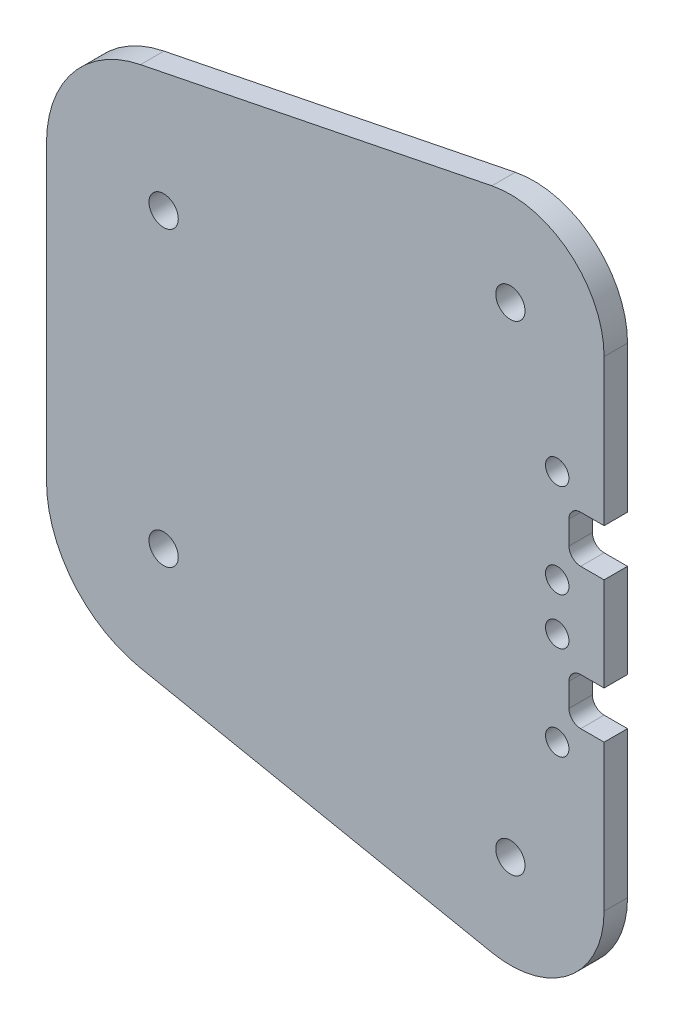
ISO-10303-21;
HEADER;
FILE_DESCRIPTION(('STEP AP214'),'2;1');
FILE_NAME('part.step','',(''),(''),'','','');
FILE_SCHEMA(('AUTOMOTIVE_DESIGN { 1 0 10303 214 1 1 1 1 }'));
ENDSEC;
DATA;
#1=APPLICATION_CONTEXT('core data for automotive mechanical design processes');
#2=APPLICATION_PROTOCOL_DEFINITION('international standard','automotive_design',2000,#1);
#3=PRODUCT_CONTEXT('',#1,'mechanical');
#4=PRODUCT('Part','Part','',(#3));
#5=PRODUCT_RELATED_PRODUCT_CATEGORY('part','',(#4));
#6=PRODUCT_DEFINITION_FORMATION('','',#4);
#7=PRODUCT_DEFINITION_CONTEXT('part definition',#1,'design');
#8=PRODUCT_DEFINITION('design','',#6,#7);
#9=PRODUCT_DEFINITION_SHAPE('','',#8);
#10=(LENGTH_UNIT() NAMED_UNIT(*) SI_UNIT(.MILLI.,.METRE.));
#11=(NAMED_UNIT(*) PLANE_ANGLE_UNIT() SI_UNIT($,.RADIAN.));
#12=(NAMED_UNIT(*) SI_UNIT($,.STERADIAN.) SOLID_ANGLE_UNIT());
#13=UNCERTAINTY_MEASURE_WITH_UNIT(LENGTH_MEASURE(1.E-05),#10,'distance_accuracy_value','');
#14=(GEOMETRIC_REPRESENTATION_CONTEXT(3) GLOBAL_UNCERTAINTY_ASSIGNED_CONTEXT((#13)) GLOBAL_UNIT_ASSIGNED_CONTEXT((#10,
#11,#12)) REPRESENTATION_CONTEXT('',''));
#15=CARTESIAN_POINT('',(0.,0.,0.));
#16=DIRECTION('',(0.,0.,1.));
#17=DIRECTION('',(1.,0.,0.));
#18=AXIS2_PLACEMENT_3D('',#15,#16,#17);
#19=CARTESIAN_POINT('',(-18.5419050672055,-9.11799410029498,2.));
#20=DIRECTION('',(0.,0.,-1.));
#21=DIRECTION('',(-1.,0.,0.));
#22=AXIS2_PLACEMENT_3D('',#19,#20,#21);
#23=PLANE('',#22);
#24=CARTESIAN_POINT('',(-18.5419050672055,-9.11799410029498,2.));
#25=DIRECTION('',(0.,0.,1.));
#26=DIRECTION('',(-1.,0.,0.));
#27=AXIS2_PLACEMENT_3D('',#24,#25,#26);
#28=CIRCLE('',#27,10.);
#29=CARTESIAN_POINT('',(-20.5157590368805,0.685265587502647,2.));
#30=VERTEX_POINT('',#29);
#31=CARTESIAN_POINT('',(-28.5419050672055,-9.11799410029498,2.));
#32=VERTEX_POINT('',#31);
#33=EDGE_CURVE('E240',#30,#32,#28,.T.);
#34=ORIENTED_EDGE('',*,*,#33,.T.);
#35=DIRECTION('',(0.,-1.,0.));
#36=VECTOR('',#35,1.);
#37=CARTESIAN_POINT('',(-28.5419050672055,-9.11799410029498,2.));
#38=LINE('',#37,#36);
#39=CARTESIAN_POINT('',(-28.5419050672054,-34.117994100295,2.));
#40=VERTEX_POINT('',#39);
#41=EDGE_CURVE('E128',#32,#40,#38,.T.);
#42=ORIENTED_EDGE('',*,*,#41,.T.);
#43=CARTESIAN_POINT('',(-18.5419050672054,-34.117994100295,2.));
#44=DIRECTION('',(0.,0.,1.));
#45=DIRECTION('',(1.,0.,0.));
#46=AXIS2_PLACEMENT_3D('',#43,#44,#45);
#47=CIRCLE('',#46,9.99999999999999);
#48=CARTESIAN_POINT('',(-20.5157590368804,-43.9212537880926,2.));
#49=VERTEX_POINT('',#48);
#50=EDGE_CURVE('E291',#40,#49,#47,.T.);
#51=ORIENTED_EDGE('',*,*,#50,.T.);
#52=DIRECTION('',(0.980325968779763,-0.197385396967504,0.));
#53=VECTOR('',#52,1.);
#54=CARTESIAN_POINT('',(-20.5157590368804,-43.9212537880926,2.));
#55=LINE('',#54,#53);
#56=CARTESIAN_POINT('',(9.47901175705458,-49.9606018505331,2.));
#57=VERTEX_POINT('',#56);
#58=EDGE_CURVE('E310',#49,#57,#55,.T.);
#59=ORIENTED_EDGE('',*,*,#58,.T.);
#60=CARTESIAN_POINT('',(11.0580949327946,-42.117994100295,2.));
#61=DIRECTION('',(0.,0.,1.));
#62=DIRECTION('',(-1.,0.,0.));
#63=AXIS2_PLACEMENT_3D('',#60,#61,#62);
#64=CIRCLE('',#63,8.);
#65=CARTESIAN_POINT('',(19.0580949327946,-42.117994100295,2.));
#66=VERTEX_POINT('',#65);
#67=EDGE_CURVE('E307',#57,#66,#64,.T.);
#68=ORIENTED_EDGE('',*,*,#67,.T.);
#69=DIRECTION('',(0.,1.,0.));
#70=VECTOR('',#69,1.);
#71=CARTESIAN_POINT('',(19.0580949327946,-29.617994100295,2.));
#72=LINE('',#71,#70);
#73=CARTESIAN_POINT('',(19.0580949327946,-29.617994100295,2.));
#74=VERTEX_POINT('',#73);
#75=EDGE_CURVE('E309',#66,#74,#72,.T.);
#76=ORIENTED_EDGE('',*,*,#75,.T.);
#77=DIRECTION('',(-1.,0.,0.));
#78=VECTOR('',#77,1.);
#79=CARTESIAN_POINT('',(19.0580949327946,-29.617994100295,2.));
#80=LINE('',#79,#78);
#81=CARTESIAN_POINT('',(17.0580949327946,-29.617994100295,2.));
#82=VERTEX_POINT('',#81);
#83=EDGE_CURVE('E312',#74,#82,#80,.T.);
#84=ORIENTED_EDGE('',*,*,#83,.T.);
#85=CARTESIAN_POINT('',(17.0580949327946,-28.617994100295,2.));
#86=DIRECTION('',(0.,0.,-1.));
#87=DIRECTION('',(1.,0.,0.));
#88=AXIS2_PLACEMENT_3D('',#85,#86,#87);
#89=CIRCLE('',#88,1.);
#90=CARTESIAN_POINT('',(16.0580949327946,-28.617994100295,2.));
#91=VERTEX_POINT('',#90);
#92=EDGE_CURVE('E318',#82,#91,#89,.T.);
#93=ORIENTED_EDGE('',*,*,#92,.T.);
#94=DIRECTION('',(0.,1.,0.));
#95=VECTOR('',#94,1.);
#96=CARTESIAN_POINT('',(16.0580949327946,-26.617994100295,2.));
#97=LINE('',#96,#95);
#98=CARTESIAN_POINT('',(16.0580949327946,-26.617994100295,2.));
#99=VERTEX_POINT('',#98);
#100=EDGE_CURVE('E320',#91,#99,#97,.T.);
#101=ORIENTED_EDGE('',*,*,#100,.T.);
#102=CARTESIAN_POINT('',(17.0580949327946,-26.617994100295,2.));
#103=DIRECTION('',(0.,0.,-1.));
#104=DIRECTION('',(1.,0.,0.));
#105=AXIS2_PLACEMENT_3D('',#102,#103,#104);
#106=CIRCLE('',#105,1.);
#107=CARTESIAN_POINT('',(17.0580949327946,-25.617994100295,2.));
#108=VERTEX_POINT('',#107);
#109=EDGE_CURVE('E322',#99,#108,#106,.T.);
#110=ORIENTED_EDGE('',*,*,#109,.T.);
#111=DIRECTION('',(1.,0.,0.));
#112=VECTOR('',#111,1.);
#113=CARTESIAN_POINT('',(19.0580949327946,-25.617994100295,2.));
#114=LINE('',#113,#112);
#115=CARTESIAN_POINT('',(19.0580949327946,-25.617994100295,2.));
#116=VERTEX_POINT('',#115);
#117=EDGE_CURVE('E324',#108,#116,#114,.T.);
#118=ORIENTED_EDGE('',*,*,#117,.T.);
#119=DIRECTION('',(0.,1.,0.));
#120=VECTOR('',#119,1.);
#121=CARTESIAN_POINT('',(19.0580949327945,-17.617994100295,2.));
#122=LINE('',#121,#120);
#123=CARTESIAN_POINT('',(19.0580949327945,-17.617994100295,2.));
#124=VERTEX_POINT('',#123);
#125=EDGE_CURVE('E326',#116,#124,#122,.T.);
#126=ORIENTED_EDGE('',*,*,#125,.T.);
#127=DIRECTION('',(-1.,0.,0.));
#128=VECTOR('',#127,1.);
#129=CARTESIAN_POINT('',(19.0580949327945,-17.617994100295,2.));
#130=LINE('',#129,#128);
#131=CARTESIAN_POINT('',(17.0580949327945,-17.617994100295,2.));
#132=VERTEX_POINT('',#131);
#133=EDGE_CURVE('E328',#124,#132,#130,.T.);
#134=ORIENTED_EDGE('',*,*,#133,.T.);
#135=CARTESIAN_POINT('',(17.0580949327945,-16.617994100295,2.));
#136=DIRECTION('',(0.,0.,-1.));
#137=DIRECTION('',(1.,0.,0.));
#138=AXIS2_PLACEMENT_3D('',#135,#136,#137);
#139=CIRCLE('',#138,1.);
#140=CARTESIAN_POINT('',(16.0580949327945,-16.617994100295,2.));
#141=VERTEX_POINT('',#140);
#142=EDGE_CURVE('E330',#132,#141,#139,.T.);
#143=ORIENTED_EDGE('',*,*,#142,.T.);
#144=DIRECTION('',(0.,1.,0.));
#145=VECTOR('',#144,1.);
#146=CARTESIAN_POINT('',(16.0580949327945,-14.617994100295,2.));
#147=LINE('',#146,#145);
#148=CARTESIAN_POINT('',(16.0580949327945,-14.617994100295,2.));
#149=VERTEX_POINT('',#148);
#150=EDGE_CURVE('E332',#141,#149,#147,.T.);
#151=ORIENTED_EDGE('',*,*,#150,.T.);
#152=CARTESIAN_POINT('',(17.0580949327945,-14.617994100295,2.));
#153=DIRECTION('',(0.,0.,-1.));
#154=DIRECTION('',(1.,0.,0.));
#155=AXIS2_PLACEMENT_3D('',#152,#153,#154);
#156=CIRCLE('',#155,1.);
#157=CARTESIAN_POINT('',(17.0580949327945,-13.617994100295,2.));
#158=VERTEX_POINT('',#157);
#159=EDGE_CURVE('E334',#149,#158,#156,.T.);
#160=ORIENTED_EDGE('',*,*,#159,.T.);
#161=DIRECTION('',(1.,0.,0.));
#162=VECTOR('',#161,1.);
#163=CARTESIAN_POINT('',(19.0580949327945,-13.617994100295,2.));
#164=LINE('',#163,#162);
#165=CARTESIAN_POINT('',(19.0580949327945,-13.617994100295,2.));
#166=VERTEX_POINT('',#165);
#167=EDGE_CURVE('E183',#158,#166,#164,.T.);
#168=ORIENTED_EDGE('',*,*,#167,.T.);
#169=DIRECTION('',(0.,1.,0.));
#170=VECTOR('',#169,1.);
#171=CARTESIAN_POINT('',(19.0580949327945,-13.617994100295,2.));
#172=LINE('',#171,#170);
#173=CARTESIAN_POINT('',(19.0580949327945,-1.11799410029498,2.));
#174=VERTEX_POINT('',#173);
#175=EDGE_CURVE('E177',#166,#174,#172,.T.);
#176=ORIENTED_EDGE('',*,*,#175,.T.);
#177=CARTESIAN_POINT('',(11.0580949327945,-1.11799410029498,2.));
#178=DIRECTION('',(0.,0.,1.));
#179=DIRECTION('',(1.,0.,0.));
#180=AXIS2_PLACEMENT_3D('',#177,#178,#179);
#181=CIRCLE('',#180,8.);
#182=CARTESIAN_POINT('',(9.4790117570545,6.72461364994313,2.));
#183=VERTEX_POINT('',#182);
#184=EDGE_CURVE('E181',#174,#183,#181,.T.);
#185=ORIENTED_EDGE('',*,*,#184,.T.);
#186=DIRECTION('',(-0.980325968779763,-0.197385396967504,0.));
#187=VECTOR('',#186,1.);
#188=CARTESIAN_POINT('',(-20.5157590368805,0.685265587502647,2.));
#189=LINE('',#188,#187);
#190=EDGE_CURVE('E49',#183,#30,#189,.T.);
#191=ORIENTED_EDGE('',*,*,#190,.T.);
#192=EDGE_LOOP('',(#34,#42,#51,#59,#68,#76,#84,#93,#101,#110,#118,#126,#134,#143,#151,#160,#168,
#176,#185,#191));
#193=FACE_BOUND('',#192,.T.);
#194=CARTESIAN_POINT('',(-18.5419050672054,-34.117994100295,2.));
#195=DIRECTION('',(0.,0.,1.));
#196=DIRECTION('',(1.,0.,0.));
#197=AXIS2_PLACEMENT_3D('',#194,#195,#196);
#198=CIRCLE('',#197,1.25);
#199=CARTESIAN_POINT('',(-17.2919050672054,-34.117994100295,2.));
#200=VERTEX_POINT('',#199);
#201=EDGE_CURVE('E205',#200,#200,#198,.T.);
#202=ORIENTED_EDGE('',*,*,#201,.F.);
#203=EDGE_LOOP('',(#202));
#204=FACE_BOUND('',#203,.T.);
#205=CARTESIAN_POINT('',(-18.5419050672055,-9.11799410029498,2.));
#206=DIRECTION('',(0.,0.,1.));
#207=DIRECTION('',(1.,0.,0.));
#208=AXIS2_PLACEMENT_3D('',#205,#206,#207);
#209=CIRCLE('',#208,1.25);
#210=CARTESIAN_POINT('',(-17.2919050672055,-9.11799410029498,2.));
#211=VERTEX_POINT('',#210);
#212=EDGE_CURVE('E438',#211,#211,#209,.T.);
#213=ORIENTED_EDGE('',*,*,#212,.F.);
#214=EDGE_LOOP('',(#213));
#215=FACE_BOUND('',#214,.T.);
#216=CARTESIAN_POINT('',(15.0580949327945,-11.617994100295,2.));
#217=DIRECTION('',(0.,0.,1.));
#218=DIRECTION('',(1.,0.,0.));
#219=AXIS2_PLACEMENT_3D('',#216,#217,#218);
#220=CIRCLE('',#219,1.);
#221=CARTESIAN_POINT('',(16.0580949327945,-11.617994100295,2.));
#222=VERTEX_POINT('',#221);
#223=EDGE_CURVE('E432',#222,#222,#220,.T.);
#224=ORIENTED_EDGE('',*,*,#223,.F.);
#225=EDGE_LOOP('',(#224));
#226=FACE_BOUND('',#225,.T.);
#227=CARTESIAN_POINT('',(11.0580949327945,-1.11799410029498,2.));
#228=DIRECTION('',(0.,0.,1.));
#229=DIRECTION('',(1.,0.,0.));
#230=AXIS2_PLACEMENT_3D('',#227,#228,#229);
#231=CIRCLE('',#230,1.25);
#232=CARTESIAN_POINT('',(12.3080949327945,-1.11799410029498,2.));
#233=VERTEX_POINT('',#232);
#234=EDGE_CURVE('E426',#233,#233,#231,.T.);
#235=ORIENTED_EDGE('',*,*,#234,.F.);
#236=EDGE_LOOP('',(#235));
#237=FACE_BOUND('',#236,.T.);
#238=CARTESIAN_POINT('',(15.0580949327945,-19.617994100295,2.));
#239=DIRECTION('',(0.,0.,1.));
#240=DIRECTION('',(1.,0.,0.));
#241=AXIS2_PLACEMENT_3D('',#238,#239,#240);
#242=CIRCLE('',#241,1.);
#243=CARTESIAN_POINT('',(16.0580949327945,-19.617994100295,2.));
#244=VERTEX_POINT('',#243);
#245=EDGE_CURVE('E420',#244,#244,#242,.T.);
#246=ORIENTED_EDGE('',*,*,#245,.F.);
#247=EDGE_LOOP('',(#246));
#248=FACE_BOUND('',#247,.T.);
#249=CARTESIAN_POINT('',(15.0580949327945,-23.617994100295,2.));
#250=DIRECTION('',(0.,0.,1.));
#251=DIRECTION('',(1.,0.,0.));
#252=AXIS2_PLACEMENT_3D('',#249,#250,#251);
#253=CIRCLE('',#252,1.);
#254=CARTESIAN_POINT('',(16.0580949327945,-23.617994100295,2.));
#255=VERTEX_POINT('',#254);
#256=EDGE_CURVE('E414',#255,#255,#253,.T.);
#257=ORIENTED_EDGE('',*,*,#256,.F.);
#258=EDGE_LOOP('',(#257));
#259=FACE_BOUND('',#258,.T.);
#260=CARTESIAN_POINT('',(15.0580949327945,-31.617994100295,2.));
#261=DIRECTION('',(0.,0.,1.));
#262=DIRECTION('',(1.,0.,0.));
#263=AXIS2_PLACEMENT_3D('',#260,#261,#262);
#264=CIRCLE('',#263,1.);
#265=CARTESIAN_POINT('',(16.0580949327945,-31.617994100295,2.));
#266=VERTEX_POINT('',#265);
#267=EDGE_CURVE('E408',#266,#266,#264,.T.);
#268=ORIENTED_EDGE('',*,*,#267,.F.);
#269=EDGE_LOOP('',(#268));
#270=FACE_BOUND('',#269,.T.);
#271=CARTESIAN_POINT('',(11.0580949327946,-42.117994100295,2.));
#272=DIRECTION('',(0.,0.,1.));
#273=DIRECTION('',(1.,0.,0.));
#274=AXIS2_PLACEMENT_3D('',#271,#272,#273);
#275=CIRCLE('',#274,1.25);
#276=CARTESIAN_POINT('',(12.3080949327946,-42.117994100295,2.));
#277=VERTEX_POINT('',#276);
#278=EDGE_CURVE('E399',#277,#277,#275,.T.);
#279=ORIENTED_EDGE('',*,*,#278,.F.);
#280=EDGE_LOOP('',(#279));
#281=FACE_BOUND('',#280,.T.);
#282=ADVANCED_FACE('F32',(#193,#204,#215,#226,#237,#248,#259,#270,#281),#23,.F.);
#283=CARTESIAN_POINT('',(-18.5419050672055,-9.11799410029498,0.));
#284=DIRECTION('',(0.,0.,-1.));
#285=DIRECTION('',(-1.,0.,0.));
#286=AXIS2_PLACEMENT_3D('',#283,#284,#285);
#287=PLANE('',#286);
#288=CARTESIAN_POINT('',(15.0580949327945,-31.617994100295,0.));
#289=DIRECTION('',(0.,0.,1.));
#290=DIRECTION('',(1.,0.,0.));
#291=AXIS2_PLACEMENT_3D('',#288,#289,#290);
#292=CIRCLE('',#291,1.);
#293=CARTESIAN_POINT('',(16.0580949327945,-31.617994100295,0.));
#294=VERTEX_POINT('',#293);
#295=EDGE_CURVE('E405',#294,#294,#292,.T.);
#296=ORIENTED_EDGE('',*,*,#295,.T.);
#297=EDGE_LOOP('',(#296));
#298=FACE_BOUND('',#297,.T.);
#299=CARTESIAN_POINT('',(15.0580949327945,-19.617994100295,0.));
#300=DIRECTION('',(0.,0.,1.));
#301=DIRECTION('',(1.,0.,0.));
#302=AXIS2_PLACEMENT_3D('',#299,#300,#301);
#303=CIRCLE('',#302,1.);
#304=CARTESIAN_POINT('',(16.0580949327945,-19.617994100295,0.));
#305=VERTEX_POINT('',#304);
#306=EDGE_CURVE('E417',#305,#305,#303,.T.);
#307=ORIENTED_EDGE('',*,*,#306,.T.);
#308=EDGE_LOOP('',(#307));
#309=FACE_BOUND('',#308,.T.);
#310=CARTESIAN_POINT('',(15.0580949327945,-11.617994100295,0.));
#311=DIRECTION('',(0.,0.,1.));
#312=DIRECTION('',(1.,0.,0.));
#313=AXIS2_PLACEMENT_3D('',#310,#311,#312);
#314=CIRCLE('',#313,1.);
#315=CARTESIAN_POINT('',(16.0580949327945,-11.617994100295,0.));
#316=VERTEX_POINT('',#315);
#317=EDGE_CURVE('E429',#316,#316,#314,.T.);
#318=ORIENTED_EDGE('',*,*,#317,.T.);
#319=EDGE_LOOP('',(#318));
#320=FACE_BOUND('',#319,.T.);
#321=CARTESIAN_POINT('',(-18.5419050672054,-34.117994100295,0.));
#322=DIRECTION('',(0.,0.,1.));
#323=DIRECTION('',(1.,0.,0.));
#324=AXIS2_PLACEMENT_3D('',#321,#322,#323);
#325=CIRCLE('',#324,1.25);
#326=CARTESIAN_POINT('',(-17.2919050672054,-34.117994100295,0.));
#327=VERTEX_POINT('',#326);
#328=EDGE_CURVE('E441',#327,#327,#325,.T.);
#329=ORIENTED_EDGE('',*,*,#328,.T.);
#330=EDGE_LOOP('',(#329));
#331=FACE_BOUND('',#330,.T.);
#332=CARTESIAN_POINT('',(-18.5419050672055,-9.11799410029498,0.));
#333=DIRECTION('',(0.,0.,1.));
#334=DIRECTION('',(-1.,0.,0.));
#335=AXIS2_PLACEMENT_3D('',#332,#333,#334);
#336=CIRCLE('',#335,10.);
#337=CARTESIAN_POINT('',(-20.5157590368805,0.685265587502647,0.));
#338=VERTEX_POINT('',#337);
#339=CARTESIAN_POINT('',(-28.5419050672055,-9.11799410029498,0.));
#340=VERTEX_POINT('',#339);
#341=EDGE_CURVE('E201',#338,#340,#336,.T.);
#342=ORIENTED_EDGE('',*,*,#341,.F.);
#343=DIRECTION('',(-0.980325968779763,-0.197385396967504,0.));
#344=VECTOR('',#343,1.);
#345=CARTESIAN_POINT('',(-20.5157590368805,0.685265587502647,0.));
#346=LINE('',#345,#344);
#347=CARTESIAN_POINT('',(9.4790117570545,6.72461364994313,0.));
#348=VERTEX_POINT('',#347);
#349=EDGE_CURVE('E120',#348,#338,#346,.T.);
#350=ORIENTED_EDGE('',*,*,#349,.F.);
#351=CARTESIAN_POINT('',(11.0580949327945,-1.11799410029498,0.));
#352=DIRECTION('',(0.,0.,1.));
#353=DIRECTION('',(1.,0.,0.));
#354=AXIS2_PLACEMENT_3D('',#351,#352,#353);
#355=CIRCLE('',#354,8.);
#356=CARTESIAN_POINT('',(19.0580949327945,-1.11799410029498,0.));
#357=VERTEX_POINT('',#356);
#358=EDGE_CURVE('E114',#357,#348,#355,.T.);
#359=ORIENTED_EDGE('',*,*,#358,.F.);
#360=DIRECTION('',(0.,1.,0.));
#361=VECTOR('',#360,1.);
#362=CARTESIAN_POINT('',(19.0580949327945,-13.617994100295,0.));
#363=LINE('',#362,#361);
#364=CARTESIAN_POINT('',(19.0580949327945,-13.617994100295,0.));
#365=VERTEX_POINT('',#364);
#366=EDGE_CURVE('E191',#365,#357,#363,.T.);
#367=ORIENTED_EDGE('',*,*,#366,.F.);
#368=DIRECTION('',(1.,0.,0.));
#369=VECTOR('',#368,1.);
#370=CARTESIAN_POINT('',(19.0580949327945,-13.617994100295,0.));
#371=LINE('',#370,#369);
#372=CARTESIAN_POINT('',(17.0580949327945,-13.617994100295,0.));
#373=VERTEX_POINT('',#372);
#374=EDGE_CURVE('E235',#373,#365,#371,.T.);
#375=ORIENTED_EDGE('',*,*,#374,.F.);
#376=CARTESIAN_POINT('',(17.0580949327945,-14.617994100295,0.));
#377=DIRECTION('',(0.,0.,-1.));
#378=DIRECTION('',(1.,0.,0.));
#379=AXIS2_PLACEMENT_3D('',#376,#377,#378);
#380=CIRCLE('',#379,1.);
#381=CARTESIAN_POINT('',(16.0580949327945,-14.617994100295,0.));
#382=VERTEX_POINT('',#381);
#383=EDGE_CURVE('E233',#382,#373,#380,.T.);
#384=ORIENTED_EDGE('',*,*,#383,.F.);
#385=DIRECTION('',(0.,1.,0.));
#386=VECTOR('',#385,1.);
#387=CARTESIAN_POINT('',(16.0580949327945,-14.617994100295,0.));
#388=LINE('',#387,#386);
#389=CARTESIAN_POINT('',(16.0580949327945,-16.617994100295,0.));
#390=VERTEX_POINT('',#389);
#391=EDGE_CURVE('E231',#390,#382,#388,.T.);
#392=ORIENTED_EDGE('',*,*,#391,.F.);
#393=CARTESIAN_POINT('',(17.0580949327945,-16.617994100295,0.));
#394=DIRECTION('',(0.,0.,-1.));
#395=DIRECTION('',(1.,0.,0.));
#396=AXIS2_PLACEMENT_3D('',#393,#394,#395);
#397=CIRCLE('',#396,1.);
#398=CARTESIAN_POINT('',(17.0580949327945,-17.617994100295,0.));
#399=VERTEX_POINT('',#398);
#400=EDGE_CURVE('E229',#399,#390,#397,.T.);
#401=ORIENTED_EDGE('',*,*,#400,.F.);
#402=DIRECTION('',(-1.,0.,0.));
#403=VECTOR('',#402,1.);
#404=CARTESIAN_POINT('',(19.0580949327945,-17.617994100295,0.));
#405=LINE('',#404,#403);
#406=CARTESIAN_POINT('',(19.0580949327945,-17.617994100295,0.));
#407=VERTEX_POINT('',#406);
#408=EDGE_CURVE('E227',#407,#399,#405,.T.);
#409=ORIENTED_EDGE('',*,*,#408,.F.);
#410=DIRECTION('',(0.,1.,0.));
#411=VECTOR('',#410,1.);
#412=CARTESIAN_POINT('',(19.0580949327945,-17.617994100295,0.));
#413=LINE('',#412,#411);
#414=CARTESIAN_POINT('',(19.0580949327946,-25.617994100295,0.));
#415=VERTEX_POINT('',#414);
#416=EDGE_CURVE('E225',#415,#407,#413,.T.);
#417=ORIENTED_EDGE('',*,*,#416,.F.);
#418=DIRECTION('',(1.,0.,0.));
#419=VECTOR('',#418,1.);
#420=CARTESIAN_POINT('',(19.0580949327946,-25.617994100295,0.));
#421=LINE('',#420,#419);
#422=CARTESIAN_POINT('',(17.0580949327946,-25.617994100295,0.));
#423=VERTEX_POINT('',#422);
#424=EDGE_CURVE('E223',#423,#415,#421,.T.);
#425=ORIENTED_EDGE('',*,*,#424,.F.);
#426=CARTESIAN_POINT('',(17.0580949327946,-26.617994100295,0.));
#427=DIRECTION('',(0.,0.,-1.));
#428=DIRECTION('',(1.,0.,0.));
#429=AXIS2_PLACEMENT_3D('',#426,#427,#428);
#430=CIRCLE('',#429,1.);
#431=CARTESIAN_POINT('',(16.0580949327946,-26.617994100295,0.));
#432=VERTEX_POINT('',#431);
#433=EDGE_CURVE('E221',#432,#423,#430,.T.);
#434=ORIENTED_EDGE('',*,*,#433,.F.);
#435=DIRECTION('',(0.,1.,0.));
#436=VECTOR('',#435,1.);
#437=CARTESIAN_POINT('',(16.0580949327946,-26.617994100295,0.));
#438=LINE('',#437,#436);
#439=CARTESIAN_POINT('',(16.0580949327946,-28.617994100295,0.));
#440=VERTEX_POINT('',#439);
#441=EDGE_CURVE('E219',#440,#432,#438,.T.);
#442=ORIENTED_EDGE('',*,*,#441,.F.);
#443=CARTESIAN_POINT('',(17.0580949327946,-28.617994100295,0.));
#444=DIRECTION('',(0.,0.,-1.));
#445=DIRECTION('',(1.,0.,0.));
#446=AXIS2_PLACEMENT_3D('',#443,#444,#445);
#447=CIRCLE('',#446,1.);
#448=CARTESIAN_POINT('',(17.0580949327946,-29.617994100295,0.));
#449=VERTEX_POINT('',#448);
#450=EDGE_CURVE('E217',#449,#440,#447,.T.);
#451=ORIENTED_EDGE('',*,*,#450,.F.);
#452=DIRECTION('',(-1.,0.,0.));
#453=VECTOR('',#452,1.);
#454=CARTESIAN_POINT('',(19.0580949327946,-29.617994100295,0.));
#455=LINE('',#454,#453);
#456=CARTESIAN_POINT('',(19.0580949327946,-29.617994100295,0.));
#457=VERTEX_POINT('',#456);
#458=EDGE_CURVE('E215',#457,#449,#455,.T.);
#459=ORIENTED_EDGE('',*,*,#458,.F.);
#460=DIRECTION('',(0.,1.,0.));
#461=VECTOR('',#460,1.);
#462=CARTESIAN_POINT('',(19.0580949327946,-29.617994100295,0.));
#463=LINE('',#462,#461);
#464=CARTESIAN_POINT('',(19.0580949327946,-42.117994100295,0.));
#465=VERTEX_POINT('',#464);
#466=EDGE_CURVE('E213',#465,#457,#463,.T.);
#467=ORIENTED_EDGE('',*,*,#466,.F.);
#468=CARTESIAN_POINT('',(11.0580949327946,-42.117994100295,0.));
#469=DIRECTION('',(0.,0.,1.));
#470=DIRECTION('',(-1.,0.,0.));
#471=AXIS2_PLACEMENT_3D('',#468,#469,#470);
#472=CIRCLE('',#471,8.);
#473=CARTESIAN_POINT('',(9.47901175705458,-49.9606018505331,0.));
#474=VERTEX_POINT('',#473);
#475=EDGE_CURVE('E211',#474,#465,#472,.T.);
#476=ORIENTED_EDGE('',*,*,#475,.F.);
#477=DIRECTION('',(0.980325968779763,-0.197385396967504,0.));
#478=VECTOR('',#477,1.);
#479=CARTESIAN_POINT('',(-20.5157590368804,-43.9212537880926,0.));
#480=LINE('',#479,#478);
#481=CARTESIAN_POINT('',(-20.5157590368804,-43.9212537880926,0.));
#482=VERTEX_POINT('',#481);
#483=EDGE_CURVE('E209',#482,#474,#480,.T.);
#484=ORIENTED_EDGE('',*,*,#483,.F.);
#485=CARTESIAN_POINT('',(-18.5419050672054,-34.117994100295,0.));
#486=DIRECTION('',(0.,0.,1.));
#487=DIRECTION('',(1.,0.,0.));
#488=AXIS2_PLACEMENT_3D('',#485,#486,#487);
#489=CIRCLE('',#488,9.99999999999999);
#490=CARTESIAN_POINT('',(-28.5419050672054,-34.117994100295,0.));
#491=VERTEX_POINT('',#490);
#492=EDGE_CURVE('E207',#491,#482,#489,.T.);
#493=ORIENTED_EDGE('',*,*,#492,.F.);
#494=DIRECTION('',(0.,-1.,0.));
#495=VECTOR('',#494,1.);
#496=CARTESIAN_POINT('',(-28.5419050672055,-9.11799410029498,0.));
#497=LINE('',#496,#495);
#498=EDGE_CURVE('E204',#340,#491,#497,.T.);
#499=ORIENTED_EDGE('',*,*,#498,.F.);
#500=EDGE_LOOP('',(#342,#350,#359,#367,#375,#384,#392,#401,#409,#417,#425,#434,#442,#451,#459,
#467,#476,#484,#493,#499));
#501=FACE_BOUND('',#500,.T.);
#502=CARTESIAN_POINT('',(-18.5419050672055,-9.11799410029498,0.));
#503=DIRECTION('',(0.,0.,1.));
#504=DIRECTION('',(1.,0.,0.));
#505=AXIS2_PLACEMENT_3D('',#502,#503,#504);
#506=CIRCLE('',#505,1.25);
#507=CARTESIAN_POINT('',(-17.2919050672055,-9.11799410029498,0.));
#508=VERTEX_POINT('',#507);
#509=EDGE_CURVE('E435',#508,#508,#506,.T.);
#510=ORIENTED_EDGE('',*,*,#509,.T.);
#511=EDGE_LOOP('',(#510));
#512=FACE_BOUND('',#511,.T.);
#513=CARTESIAN_POINT('',(11.0580949327945,-1.11799410029498,0.));
#514=DIRECTION('',(0.,0.,1.));
#515=DIRECTION('',(1.,0.,0.));
#516=AXIS2_PLACEMENT_3D('',#513,#514,#515);
#517=CIRCLE('',#516,1.25);
#518=CARTESIAN_POINT('',(12.3080949327945,-1.11799410029498,0.));
#519=VERTEX_POINT('',#518);
#520=EDGE_CURVE('E423',#519,#519,#517,.T.);
#521=ORIENTED_EDGE('',*,*,#520,.T.);
#522=EDGE_LOOP('',(#521));
#523=FACE_BOUND('',#522,.T.);
#524=CARTESIAN_POINT('',(15.0580949327945,-23.617994100295,0.));
#525=DIRECTION('',(0.,0.,1.));
#526=DIRECTION('',(1.,0.,0.));
#527=AXIS2_PLACEMENT_3D('',#524,#525,#526);
#528=CIRCLE('',#527,1.);
#529=CARTESIAN_POINT('',(16.0580949327945,-23.617994100295,0.));
#530=VERTEX_POINT('',#529);
#531=EDGE_CURVE('E411',#530,#530,#528,.T.);
#532=ORIENTED_EDGE('',*,*,#531,.T.);
#533=EDGE_LOOP('',(#532));
#534=FACE_BOUND('',#533,.T.);
#535=CARTESIAN_POINT('',(11.0580949327946,-42.117994100295,0.));
#536=DIRECTION('',(0.,0.,1.));
#537=DIRECTION('',(1.,0.,0.));
#538=AXIS2_PLACEMENT_3D('',#535,#536,#537);
#539=CIRCLE('',#538,1.25);
#540=CARTESIAN_POINT('',(12.3080949327946,-42.117994100295,0.));
#541=VERTEX_POINT('',#540);
#542=EDGE_CURVE('E402',#541,#541,#539,.T.);
#543=ORIENTED_EDGE('',*,*,#542,.T.);
#544=EDGE_LOOP('',(#543));
#545=FACE_BOUND('',#544,.T.);
#546=ADVANCED_FACE('F295',(#298,#309,#320,#331,#501,#512,#523,#534,#545),#287,.T.);
#547=CARTESIAN_POINT('',(-18.5419050672055,-9.11799410029498,2.));
#548=DIRECTION('',(0.,0.,-1.));
#549=DIRECTION('',(-1.,0.,0.));
#550=AXIS2_PLACEMENT_3D('',#547,#548,#549);
#551=CYLINDRICAL_SURFACE('',#550,10.);
#552=ORIENTED_EDGE('',*,*,#341,.T.);
#553=DIRECTION('',(0.,0.,-1.));
#554=VECTOR('',#553,1.);
#555=CARTESIAN_POINT('',(-28.5419050672055,-9.11799410029498,2.));
#556=LINE('',#555,#554);
#557=EDGE_CURVE('E11',#32,#340,#556,.T.);
#558=ORIENTED_EDGE('',*,*,#557,.F.);
#559=ORIENTED_EDGE('',*,*,#33,.F.);
#560=DIRECTION('',(0.,0.,-1.));
#561=VECTOR('',#560,1.);
#562=CARTESIAN_POINT('',(-20.5157590368805,0.685265587502647,2.));
#563=LINE('',#562,#561);
#564=EDGE_CURVE('E197',#30,#338,#563,.T.);
#565=ORIENTED_EDGE('',*,*,#564,.T.);
#566=EDGE_LOOP('',(#552,#558,#559,#565));
#567=FACE_BOUND('',#566,.T.);
#568=ADVANCED_FACE('F34',(#567),#551,.T.);
#569=CARTESIAN_POINT('',(-28.5419050672055,-9.11799410029498,2.));
#570=DIRECTION('',(1.,0.,0.));
#571=DIRECTION('',(0.,1.,0.));
#572=AXIS2_PLACEMENT_3D('',#569,#570,#571);
#573=PLANE('',#572);
#574=ORIENTED_EDGE('',*,*,#498,.T.);
#575=DIRECTION('',(0.,0.,-1.));
#576=VECTOR('',#575,1.);
#577=CARTESIAN_POINT('',(-28.5419050672054,-34.117994100295,2.));
#578=LINE('',#577,#576);
#579=EDGE_CURVE('E41',#40,#491,#578,.T.);
#580=ORIENTED_EDGE('',*,*,#579,.F.);
#581=ORIENTED_EDGE('',*,*,#41,.F.);
#582=ORIENTED_EDGE('',*,*,#557,.T.);
#583=EDGE_LOOP('',(#574,#580,#581,#582));
#584=FACE_BOUND('',#583,.T.);
#585=ADVANCED_FACE('F669',(#584),#573,.F.);
#586=CARTESIAN_POINT('',(-18.5419050672054,-34.117994100295,2.));
#587=DIRECTION('',(0.,0.,-1.));
#588=DIRECTION('',(-1.,0.,0.));
#589=AXIS2_PLACEMENT_3D('',#586,#587,#588);
#590=CYLINDRICAL_SURFACE('',#589,9.99999999999999);
#591=ORIENTED_EDGE('',*,*,#492,.T.);
#592=DIRECTION('',(0.,0.,-1.));
#593=VECTOR('',#592,1.);
#594=CARTESIAN_POINT('',(-20.5157590368804,-43.9212537880926,2.));
#595=LINE('',#594,#593);
#596=EDGE_CURVE('E283',#49,#482,#595,.T.);
#597=ORIENTED_EDGE('',*,*,#596,.F.);
#598=ORIENTED_EDGE('',*,*,#50,.F.);
#599=ORIENTED_EDGE('',*,*,#579,.T.);
#600=EDGE_LOOP('',(#591,#597,#598,#599));
#601=FACE_BOUND('',#600,.T.);
#602=ADVANCED_FACE('F289',(#601),#590,.T.);
#603=CARTESIAN_POINT('',(-20.5157590368804,-43.9212537880926,2.));
#604=DIRECTION('',(0.197385396967504,0.980325968779763,0.));
#605=DIRECTION('',(-0.980325968779763,0.197385396967504,0.));
#606=AXIS2_PLACEMENT_3D('',#603,#604,#605);
#607=PLANE('',#606);
#608=ORIENTED_EDGE('',*,*,#483,.T.);
#609=DIRECTION('',(0.,0.,-1.));
#610=VECTOR('',#609,1.);
#611=CARTESIAN_POINT('',(9.47901175705458,-49.9606018505331,2.));
#612=LINE('',#611,#610);
#613=EDGE_CURVE('E280',#57,#474,#612,.T.);
#614=ORIENTED_EDGE('',*,*,#613,.F.);
#615=ORIENTED_EDGE('',*,*,#58,.F.);
#616=ORIENTED_EDGE('',*,*,#596,.T.);
#617=EDGE_LOOP('',(#608,#614,#615,#616));
#618=FACE_BOUND('',#617,.T.);
#619=ADVANCED_FACE('F301',(#618),#607,.F.);
#620=CARTESIAN_POINT('',(11.0580949327946,-42.117994100295,2.));
#621=DIRECTION('',(0.,0.,-1.));
#622=DIRECTION('',(-1.,0.,0.));
#623=AXIS2_PLACEMENT_3D('',#620,#621,#622);
#624=CYLINDRICAL_SURFACE('',#623,8.);
#625=ORIENTED_EDGE('',*,*,#475,.T.);
#626=DIRECTION('',(0.,0.,-1.));
#627=VECTOR('',#626,1.);
#628=CARTESIAN_POINT('',(19.0580949327946,-42.117994100295,2.));
#629=LINE('',#628,#627);
#630=EDGE_CURVE('E277',#66,#465,#629,.T.);
#631=ORIENTED_EDGE('',*,*,#630,.F.);
#632=ORIENTED_EDGE('',*,*,#67,.F.);
#633=ORIENTED_EDGE('',*,*,#613,.T.);
#634=EDGE_LOOP('',(#625,#631,#632,#633));
#635=FACE_BOUND('',#634,.T.);
#636=ADVANCED_FACE('F305',(#635),#624,.T.);
#637=CARTESIAN_POINT('',(19.0580949327946,-29.617994100295,2.));
#638=DIRECTION('',(-1.,0.,0.));
#639=DIRECTION('',(0.,-1.,0.));
#640=AXIS2_PLACEMENT_3D('',#637,#638,#639);
#641=PLANE('',#640);
#642=ORIENTED_EDGE('',*,*,#466,.T.);
#643=DIRECTION('',(0.,0.,-1.));
#644=VECTOR('',#643,1.);
#645=CARTESIAN_POINT('',(19.0580949327946,-29.617994100295,2.));
#646=LINE('',#645,#644);
#647=EDGE_CURVE('E274',#74,#457,#646,.T.);
#648=ORIENTED_EDGE('',*,*,#647,.F.);
#649=ORIENTED_EDGE('',*,*,#75,.F.);
#650=ORIENTED_EDGE('',*,*,#630,.T.);
#651=EDGE_LOOP('',(#642,#648,#649,#650));
#652=FACE_BOUND('',#651,.T.);
#653=ADVANCED_FACE('F634',(#652),#641,.F.);
#654=CARTESIAN_POINT('',(19.0580949327946,-29.617994100295,2.));
#655=DIRECTION('',(0.,-1.,0.));
#656=DIRECTION('',(0.,0.,-1.));
#657=AXIS2_PLACEMENT_3D('',#654,#655,#656);
#658=PLANE('',#657);
#659=ORIENTED_EDGE('',*,*,#458,.T.);
#660=DIRECTION('',(0.,0.,-1.));
#661=VECTOR('',#660,1.);
#662=CARTESIAN_POINT('',(17.0580949327946,-29.617994100295,2.));
#663=LINE('',#662,#661);
#664=EDGE_CURVE('E271',#82,#449,#663,.T.);
#665=ORIENTED_EDGE('',*,*,#664,.F.);
#666=ORIENTED_EDGE('',*,*,#83,.F.);
#667=ORIENTED_EDGE('',*,*,#647,.T.);
#668=EDGE_LOOP('',(#659,#665,#666,#667));
#669=FACE_BOUND('',#668,.T.);
#670=ADVANCED_FACE('F624',(#669),#658,.F.);
#671=CARTESIAN_POINT('',(17.0580949327946,-28.617994100295,2.));
#672=DIRECTION('',(0.,0.,-1.));
#673=DIRECTION('',(-1.,0.,0.));
#674=AXIS2_PLACEMENT_3D('',#671,#672,#673);
#675=CYLINDRICAL_SURFACE('',#674,1.);
#676=ORIENTED_EDGE('',*,*,#450,.T.);
#677=DIRECTION('',(0.,0.,-1.));
#678=VECTOR('',#677,1.);
#679=CARTESIAN_POINT('',(16.0580949327946,-28.617994100295,2.));
#680=LINE('',#679,#678);
#681=EDGE_CURVE('E268',#91,#440,#680,.T.);
#682=ORIENTED_EDGE('',*,*,#681,.F.);
#683=ORIENTED_EDGE('',*,*,#92,.F.);
#684=ORIENTED_EDGE('',*,*,#664,.T.);
#685=EDGE_LOOP('',(#676,#682,#683,#684));
#686=FACE_BOUND('',#685,.T.);
#687=ADVANCED_FACE('F614',(#686),#675,.F.);
#688=CARTESIAN_POINT('',(16.0580949327946,-26.617994100295,2.));
#689=DIRECTION('',(-1.,0.,0.));
#690=DIRECTION('',(0.,0.,1.));
#691=AXIS2_PLACEMENT_3D('',#688,#689,#690);
#692=PLANE('',#691);
#693=ORIENTED_EDGE('',*,*,#441,.T.);
#694=DIRECTION('',(0.,0.,-1.));
#695=VECTOR('',#694,1.);
#696=CARTESIAN_POINT('',(16.0580949327946,-26.617994100295,2.));
#697=LINE('',#696,#695);
#698=EDGE_CURVE('E265',#99,#432,#697,.T.);
#699=ORIENTED_EDGE('',*,*,#698,.F.);
#700=ORIENTED_EDGE('',*,*,#100,.F.);
#701=ORIENTED_EDGE('',*,*,#681,.T.);
#702=EDGE_LOOP('',(#693,#699,#700,#701));
#703=FACE_BOUND('',#702,.T.);
#704=ADVANCED_FACE('F604',(#703),#692,.F.);
#705=CARTESIAN_POINT('',(17.0580949327946,-26.617994100295,2.));
#706=DIRECTION('',(0.,0.,-1.));
#707=DIRECTION('',(-1.,0.,0.));
#708=AXIS2_PLACEMENT_3D('',#705,#706,#707);
#709=CYLINDRICAL_SURFACE('',#708,1.);
#710=ORIENTED_EDGE('',*,*,#433,.T.);
#711=DIRECTION('',(0.,0.,-1.));
#712=VECTOR('',#711,1.);
#713=CARTESIAN_POINT('',(17.0580949327946,-25.617994100295,2.));
#714=LINE('',#713,#712);
#715=EDGE_CURVE('E262',#108,#423,#714,.T.);
#716=ORIENTED_EDGE('',*,*,#715,.F.);
#717=ORIENTED_EDGE('',*,*,#109,.F.);
#718=ORIENTED_EDGE('',*,*,#698,.T.);
#719=EDGE_LOOP('',(#710,#716,#717,#718));
#720=FACE_BOUND('',#719,.T.);
#721=ADVANCED_FACE('F594',(#720),#709,.F.);
#722=CARTESIAN_POINT('',(19.0580949327946,-25.617994100295,2.));
#723=DIRECTION('',(0.,1.,0.));
#724=DIRECTION('',(0.,0.,1.));
#725=AXIS2_PLACEMENT_3D('',#722,#723,#724);
#726=PLANE('',#725);
#727=ORIENTED_EDGE('',*,*,#424,.T.);
#728=DIRECTION('',(0.,0.,-1.));
#729=VECTOR('',#728,1.);
#730=CARTESIAN_POINT('',(19.0580949327946,-25.617994100295,2.));
#731=LINE('',#730,#729);
#732=EDGE_CURVE('E259',#116,#415,#731,.T.);
#733=ORIENTED_EDGE('',*,*,#732,.F.);
#734=ORIENTED_EDGE('',*,*,#117,.F.);
#735=ORIENTED_EDGE('',*,*,#715,.T.);
#736=EDGE_LOOP('',(#727,#733,#734,#735));
#737=FACE_BOUND('',#736,.T.);
#738=ADVANCED_FACE('F584',(#737),#726,.F.);
#739=CARTESIAN_POINT('',(19.0580949327945,-17.617994100295,2.));
#740=DIRECTION('',(-1.,0.,0.));
#741=DIRECTION('',(0.,-1.,0.));
#742=AXIS2_PLACEMENT_3D('',#739,#740,#741);
#743=PLANE('',#742);
#744=ORIENTED_EDGE('',*,*,#416,.T.);
#745=DIRECTION('',(0.,0.,-1.));
#746=VECTOR('',#745,1.);
#747=CARTESIAN_POINT('',(19.0580949327945,-17.617994100295,2.));
#748=LINE('',#747,#746);
#749=EDGE_CURVE('E256',#124,#407,#748,.T.);
#750=ORIENTED_EDGE('',*,*,#749,.F.);
#751=ORIENTED_EDGE('',*,*,#125,.F.);
#752=ORIENTED_EDGE('',*,*,#732,.T.);
#753=EDGE_LOOP('',(#744,#750,#751,#752));
#754=FACE_BOUND('',#753,.T.);
#755=ADVANCED_FACE('F574',(#754),#743,.F.);
#756=CARTESIAN_POINT('',(19.0580949327945,-17.617994100295,2.));
#757=DIRECTION('',(0.,-1.,0.));
#758=DIRECTION('',(0.,0.,-1.));
#759=AXIS2_PLACEMENT_3D('',#756,#757,#758);
#760=PLANE('',#759);
#761=ORIENTED_EDGE('',*,*,#408,.T.);
#762=DIRECTION('',(0.,0.,-1.));
#763=VECTOR('',#762,1.);
#764=CARTESIAN_POINT('',(17.0580949327945,-17.617994100295,2.));
#765=LINE('',#764,#763);
#766=EDGE_CURVE('E253',#132,#399,#765,.T.);
#767=ORIENTED_EDGE('',*,*,#766,.F.);
#768=ORIENTED_EDGE('',*,*,#133,.F.);
#769=ORIENTED_EDGE('',*,*,#749,.T.);
#770=EDGE_LOOP('',(#761,#767,#768,#769));
#771=FACE_BOUND('',#770,.T.);
#772=ADVANCED_FACE('F564',(#771),#760,.F.);
#773=CARTESIAN_POINT('',(17.0580949327945,-16.617994100295,2.));
#774=DIRECTION('',(0.,0.,-1.));
#775=DIRECTION('',(-1.,0.,0.));
#776=AXIS2_PLACEMENT_3D('',#773,#774,#775);
#777=CYLINDRICAL_SURFACE('',#776,1.);
#778=ORIENTED_EDGE('',*,*,#400,.T.);
#779=DIRECTION('',(0.,0.,-1.));
#780=VECTOR('',#779,1.);
#781=CARTESIAN_POINT('',(16.0580949327945,-16.617994100295,2.));
#782=LINE('',#781,#780);
#783=EDGE_CURVE('E250',#141,#390,#782,.T.);
#784=ORIENTED_EDGE('',*,*,#783,.F.);
#785=ORIENTED_EDGE('',*,*,#142,.F.);
#786=ORIENTED_EDGE('',*,*,#766,.T.);
#787=EDGE_LOOP('',(#778,#784,#785,#786));
#788=FACE_BOUND('',#787,.T.);
#789=ADVANCED_FACE('F554',(#788),#777,.F.);
#790=CARTESIAN_POINT('',(16.0580949327945,-14.617994100295,2.));
#791=DIRECTION('',(-1.,0.,0.));
#792=DIRECTION('',(0.,-1.,0.));
#793=AXIS2_PLACEMENT_3D('',#790,#791,#792);
#794=PLANE('',#793);
#795=ORIENTED_EDGE('',*,*,#391,.T.);
#796=DIRECTION('',(0.,0.,-1.));
#797=VECTOR('',#796,1.);
#798=CARTESIAN_POINT('',(16.0580949327945,-14.617994100295,2.));
#799=LINE('',#798,#797);
#800=EDGE_CURVE('E247',#149,#382,#799,.T.);
#801=ORIENTED_EDGE('',*,*,#800,.F.);
#802=ORIENTED_EDGE('',*,*,#150,.F.);
#803=ORIENTED_EDGE('',*,*,#783,.T.);
#804=EDGE_LOOP('',(#795,#801,#802,#803));
#805=FACE_BOUND('',#804,.T.);
#806=ADVANCED_FACE('F545',(#805),#794,.F.);
#807=CARTESIAN_POINT('',(17.0580949327945,-14.617994100295,2.));
#808=DIRECTION('',(0.,0.,-1.));
#809=DIRECTION('',(-1.,0.,0.));
#810=AXIS2_PLACEMENT_3D('',#807,#808,#809);
#811=CYLINDRICAL_SURFACE('',#810,1.);
#812=ORIENTED_EDGE('',*,*,#383,.T.);
#813=DIRECTION('',(0.,0.,-1.));
#814=VECTOR('',#813,1.);
#815=CARTESIAN_POINT('',(17.0580949327945,-13.617994100295,2.));
#816=LINE('',#815,#814);
#817=EDGE_CURVE('E244',#158,#373,#816,.T.);
#818=ORIENTED_EDGE('',*,*,#817,.F.);
#819=ORIENTED_EDGE('',*,*,#159,.F.);
#820=ORIENTED_EDGE('',*,*,#800,.T.);
#821=EDGE_LOOP('',(#812,#818,#819,#820));
#822=FACE_BOUND('',#821,.T.);
#823=ADVANCED_FACE('F340',(#822),#811,.F.);
#824=CARTESIAN_POINT('',(19.0580949327945,-13.617994100295,2.));
#825=DIRECTION('',(0.,1.,0.));
#826=DIRECTION('',(0.,0.,1.));
#827=AXIS2_PLACEMENT_3D('',#824,#825,#826);
#828=PLANE('',#827);
#829=ORIENTED_EDGE('',*,*,#374,.T.);
#830=DIRECTION('',(0.,0.,-1.));
#831=VECTOR('',#830,1.);
#832=CARTESIAN_POINT('',(19.0580949327945,-13.617994100295,2.));
#833=LINE('',#832,#831);
#834=EDGE_CURVE('E192',#166,#365,#833,.T.);
#835=ORIENTED_EDGE('',*,*,#834,.F.);
#836=ORIENTED_EDGE('',*,*,#167,.F.);
#837=ORIENTED_EDGE('',*,*,#817,.T.);
#838=EDGE_LOOP('',(#829,#835,#836,#837));
#839=FACE_BOUND('',#838,.T.);
#840=ADVANCED_FACE('F344',(#839),#828,.F.);
#841=CARTESIAN_POINT('',(19.0580949327945,-13.617994100295,2.));
#842=DIRECTION('',(-1.,0.,0.));
#843=DIRECTION('',(0.,-1.,0.));
#844=AXIS2_PLACEMENT_3D('',#841,#842,#843);
#845=PLANE('',#844);
#846=ORIENTED_EDGE('',*,*,#366,.T.);
#847=DIRECTION('',(0.,0.,-1.));
#848=VECTOR('',#847,1.);
#849=CARTESIAN_POINT('',(19.0580949327945,-1.11799410029498,2.));
#850=LINE('',#849,#848);
#851=EDGE_CURVE('E188',#174,#357,#850,.T.);
#852=ORIENTED_EDGE('',*,*,#851,.F.);
#853=ORIENTED_EDGE('',*,*,#175,.F.);
#854=ORIENTED_EDGE('',*,*,#834,.T.);
#855=EDGE_LOOP('',(#846,#852,#853,#854));
#856=FACE_BOUND('',#855,.T.);
#857=ADVANCED_FACE('F189',(#856),#845,.F.);
#858=CARTESIAN_POINT('',(11.0580949327945,-1.11799410029498,2.));
#859=DIRECTION('',(0.,0.,-1.));
#860=DIRECTION('',(-1.,0.,0.));
#861=AXIS2_PLACEMENT_3D('',#858,#859,#860);
#862=CYLINDRICAL_SURFACE('',#861,8.);
#863=ORIENTED_EDGE('',*,*,#358,.T.);
#864=DIRECTION('',(0.,0.,-1.));
#865=VECTOR('',#864,1.);
#866=CARTESIAN_POINT('',(9.4790117570545,6.72461364994313,2.));
#867=LINE('',#866,#865);
#868=EDGE_CURVE('E193',#183,#348,#867,.T.);
#869=ORIENTED_EDGE('',*,*,#868,.F.);
#870=ORIENTED_EDGE('',*,*,#184,.F.);
#871=ORIENTED_EDGE('',*,*,#851,.T.);
#872=EDGE_LOOP('',(#863,#869,#870,#871));
#873=FACE_BOUND('',#872,.T.);
#874=ADVANCED_FACE('F195',(#873),#862,.T.);
#875=CARTESIAN_POINT('',(-20.5157590368805,0.685265587502647,2.));
#876=DIRECTION('',(0.197385396967504,-0.980325968779763,0.));
#877=DIRECTION('',(0.980325968779763,0.197385396967504,0.));
#878=AXIS2_PLACEMENT_3D('',#875,#876,#877);
#879=PLANE('',#878);
#880=ORIENTED_EDGE('',*,*,#349,.T.);
#881=ORIENTED_EDGE('',*,*,#564,.F.);
#882=ORIENTED_EDGE('',*,*,#190,.F.);
#883=ORIENTED_EDGE('',*,*,#868,.T.);
#884=EDGE_LOOP('',(#880,#881,#882,#883));
#885=FACE_BOUND('',#884,.T.);
#886=ADVANCED_FACE('F348',(#885),#879,.F.);
#887=CARTESIAN_POINT('',(-18.5419050672054,-34.117994100295,2.));
#888=DIRECTION('',(0.,0.,-1.));
#889=DIRECTION('',(-1.,0.,0.));
#890=AXIS2_PLACEMENT_3D('',#887,#888,#889);
#891=CYLINDRICAL_SURFACE('',#890,1.25);
#892=ORIENTED_EDGE('',*,*,#201,.T.);
#893=EDGE_LOOP('',(#892));
#894=FACE_BOUND('',#893,.T.);
#895=ORIENTED_EDGE('',*,*,#328,.F.);
#896=EDGE_LOOP('',(#895));
#897=FACE_BOUND('',#896,.T.);
#898=ADVANCED_FACE('F350',(#894,#897),#891,.F.);
#899=CARTESIAN_POINT('',(-18.5419050672055,-9.11799410029498,2.));
#900=DIRECTION('',(0.,0.,-1.));
#901=DIRECTION('',(-1.,0.,0.));
#902=AXIS2_PLACEMENT_3D('',#899,#900,#901);
#903=CYLINDRICAL_SURFACE('',#902,1.25);
#904=ORIENTED_EDGE('',*,*,#212,.T.);
#905=EDGE_LOOP('',(#904));
#906=FACE_BOUND('',#905,.T.);
#907=ORIENTED_EDGE('',*,*,#509,.F.);
#908=EDGE_LOOP('',(#907));
#909=FACE_BOUND('',#908,.T.);
#910=ADVANCED_FACE('F356',(#906,#909),#903,.F.);
#911=CARTESIAN_POINT('',(15.0580949327945,-11.617994100295,2.));
#912=DIRECTION('',(0.,0.,-1.));
#913=DIRECTION('',(-1.,0.,0.));
#914=AXIS2_PLACEMENT_3D('',#911,#912,#913);
#915=CYLINDRICAL_SURFACE('',#914,1.);
#916=ORIENTED_EDGE('',*,*,#223,.T.);
#917=EDGE_LOOP('',(#916));
#918=FACE_BOUND('',#917,.T.);
#919=ORIENTED_EDGE('',*,*,#317,.F.);
#920=EDGE_LOOP('',(#919));
#921=FACE_BOUND('',#920,.T.);
#922=ADVANCED_FACE('F370',(#918,#921),#915,.F.);
#923=CARTESIAN_POINT('',(11.0580949327945,-1.11799410029498,2.));
#924=DIRECTION('',(0.,0.,-1.));
#925=DIRECTION('',(-1.,0.,0.));
#926=AXIS2_PLACEMENT_3D('',#923,#924,#925);
#927=CYLINDRICAL_SURFACE('',#926,1.25);
#928=ORIENTED_EDGE('',*,*,#234,.T.);
#929=EDGE_LOOP('',(#928));
#930=FACE_BOUND('',#929,.T.);
#931=ORIENTED_EDGE('',*,*,#520,.F.);
#932=EDGE_LOOP('',(#931));
#933=FACE_BOUND('',#932,.T.);
#934=ADVANCED_FACE('F374',(#930,#933),#927,.F.);
#935=CARTESIAN_POINT('',(15.0580949327945,-19.617994100295,2.));
#936=DIRECTION('',(0.,0.,-1.));
#937=DIRECTION('',(-1.,0.,0.));
#938=AXIS2_PLACEMENT_3D('',#935,#936,#937);
#939=CYLINDRICAL_SURFACE('',#938,1.);
#940=ORIENTED_EDGE('',*,*,#245,.T.);
#941=EDGE_LOOP('',(#940));
#942=FACE_BOUND('',#941,.T.);
#943=ORIENTED_EDGE('',*,*,#306,.F.);
#944=EDGE_LOOP('',(#943));
#945=FACE_BOUND('',#944,.T.);
#946=ADVANCED_FACE('F378',(#942,#945),#939,.F.);
#947=CARTESIAN_POINT('',(15.0580949327945,-23.617994100295,2.));
#948=DIRECTION('',(0.,0.,-1.));
#949=DIRECTION('',(-1.,0.,0.));
#950=AXIS2_PLACEMENT_3D('',#947,#948,#949);
#951=CYLINDRICAL_SURFACE('',#950,1.);
#952=ORIENTED_EDGE('',*,*,#256,.T.);
#953=EDGE_LOOP('',(#952));
#954=FACE_BOUND('',#953,.T.);
#955=ORIENTED_EDGE('',*,*,#531,.F.);
#956=EDGE_LOOP('',(#955));
#957=FACE_BOUND('',#956,.T.);
#958=ADVANCED_FACE('F382',(#954,#957),#951,.F.);
#959=CARTESIAN_POINT('',(15.0580949327945,-31.617994100295,2.));
#960=DIRECTION('',(0.,0.,-1.));
#961=DIRECTION('',(-1.,0.,0.));
#962=AXIS2_PLACEMENT_3D('',#959,#960,#961);
#963=CYLINDRICAL_SURFACE('',#962,1.);
#964=ORIENTED_EDGE('',*,*,#267,.T.);
#965=EDGE_LOOP('',(#964));
#966=FACE_BOUND('',#965,.T.);
#967=ORIENTED_EDGE('',*,*,#295,.F.);
#968=EDGE_LOOP('',(#967));
#969=FACE_BOUND('',#968,.T.);
#970=ADVANCED_FACE('F386',(#966,#969),#963,.F.);
#971=CARTESIAN_POINT('',(11.0580949327946,-42.117994100295,2.));
#972=DIRECTION('',(0.,0.,-1.));
#973=DIRECTION('',(-1.,0.,0.));
#974=AXIS2_PLACEMENT_3D('',#971,#972,#973);
#975=CYLINDRICAL_SURFACE('',#974,1.25);
#976=ORIENTED_EDGE('',*,*,#278,.T.);
#977=EDGE_LOOP('',(#976));
#978=FACE_BOUND('',#977,.T.);
#979=ORIENTED_EDGE('',*,*,#542,.F.);
#980=EDGE_LOOP('',(#979));
#981=FACE_BOUND('',#980,.T.);
#982=ADVANCED_FACE('F390',(#978,#981),#975,.F.);
#983=CLOSED_SHELL('',(#282,#546,#568,#585,#602,#619,#636,#653,#670,#687,#704,#721,#738,#755,
#772,#789,#806,#823,#840,#857,#874,#886,#898,#910,#922,#934,#946,#958,#970,#982));
#984=MANIFOLD_SOLID_BREP('B2',#983);
#985=ADVANCED_BREP_SHAPE_REPRESENTATION('',(#18,#984),#14);
#986=SHAPE_DEFINITION_REPRESENTATION(#9,#985);
ENDSEC;
END-ISO-10303-21;
